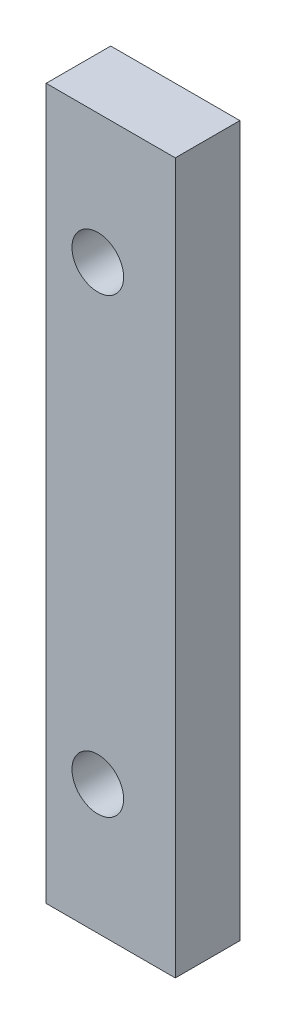
ISO-10303-21;
HEADER;
FILE_DESCRIPTION(('STEP AP214'),'2;1');
FILE_NAME('part.step','',(''),(''),'','','');
FILE_SCHEMA(('AUTOMOTIVE_DESIGN { 1 0 10303 214 1 1 1 1 }'));
ENDSEC;
DATA;
#1=APPLICATION_CONTEXT('core data for automotive mechanical design processes');
#2=APPLICATION_PROTOCOL_DEFINITION('international standard','automotive_design',2000,#1);
#3=PRODUCT_CONTEXT('',#1,'mechanical');
#4=PRODUCT('Part','Part','',(#3));
#5=PRODUCT_RELATED_PRODUCT_CATEGORY('part','',(#4));
#6=PRODUCT_DEFINITION_FORMATION('','',#4);
#7=PRODUCT_DEFINITION_CONTEXT('part definition',#1,'design');
#8=PRODUCT_DEFINITION('design','',#6,#7);
#9=PRODUCT_DEFINITION_SHAPE('','',#8);
#10=(LENGTH_UNIT() NAMED_UNIT(*) SI_UNIT(.MILLI.,.METRE.));
#11=(NAMED_UNIT(*) PLANE_ANGLE_UNIT() SI_UNIT($,.RADIAN.));
#12=(NAMED_UNIT(*) SI_UNIT($,.STERADIAN.) SOLID_ANGLE_UNIT());
#13=UNCERTAINTY_MEASURE_WITH_UNIT(LENGTH_MEASURE(1.E-05),#10,'distance_accuracy_value','');
#14=(GEOMETRIC_REPRESENTATION_CONTEXT(3) GLOBAL_UNCERTAINTY_ASSIGNED_CONTEXT((#13)) GLOBAL_UNIT_ASSIGNED_CONTEXT((#10,
#11,#12)) REPRESENTATION_CONTEXT('',''));
#15=CARTESIAN_POINT('',(0.,0.,0.));
#16=DIRECTION('',(0.,0.,1.));
#17=DIRECTION('',(1.,0.,0.));
#18=AXIS2_PLACEMENT_3D('',#15,#16,#17);
#19=CARTESIAN_POINT('',(0.,0.,5.));
#20=DIRECTION('',(0.,0.,1.));
#21=DIRECTION('',(1.,0.,0.));
#22=AXIS2_PLACEMENT_3D('',#19,#20,#21);
#23=PLANE('',#22);
#24=CARTESIAN_POINT('',(-6.,45.,5.));
#25=DIRECTION('',(0.,0.,1.));
#26=DIRECTION('',(1.,0.,0.));
#27=AXIS2_PLACEMENT_3D('',#24,#25,#26);
#28=CIRCLE('',#27,2.);
#29=CARTESIAN_POINT('',(-4.,45.,5.));
#30=VERTEX_POINT('',#29);
#31=EDGE_CURVE('E102',#30,#30,#28,.T.);
#32=ORIENTED_EDGE('',*,*,#31,.F.);
#33=EDGE_LOOP('',(#32));
#34=FACE_BOUND('',#33,.T.);
#35=DIRECTION('',(0.,1.,0.));
#36=VECTOR('',#35,1.);
#37=CARTESIAN_POINT('',(0.,0.,5.));
#38=LINE('',#37,#36);
#39=CARTESIAN_POINT('',(0.,0.,5.));
#40=VERTEX_POINT('',#39);
#41=CARTESIAN_POINT('',(0.,55.,5.));
#42=VERTEX_POINT('',#41);
#43=EDGE_CURVE('E87',#40,#42,#38,.T.);
#44=ORIENTED_EDGE('',*,*,#43,.T.);
#45=DIRECTION('',(-1.,0.,0.));
#46=VECTOR('',#45,1.);
#47=CARTESIAN_POINT('',(0.,55.,5.));
#48=LINE('',#47,#46);
#49=CARTESIAN_POINT('',(-10.,55.,5.));
#50=VERTEX_POINT('',#49);
#51=EDGE_CURVE('E82',#42,#50,#48,.T.);
#52=ORIENTED_EDGE('',*,*,#51,.T.);
#53=DIRECTION('',(0.,-1.,0.));
#54=VECTOR('',#53,1.);
#55=CARTESIAN_POINT('',(-10.,0.,5.));
#56=LINE('',#55,#54);
#57=CARTESIAN_POINT('',(-10.,0.,5.));
#58=VERTEX_POINT('',#57);
#59=EDGE_CURVE('E85',#50,#58,#56,.T.);
#60=ORIENTED_EDGE('',*,*,#59,.T.);
#61=DIRECTION('',(1.,0.,0.));
#62=VECTOR('',#61,1.);
#63=CARTESIAN_POINT('',(0.,0.,5.));
#64=LINE('',#63,#62);
#65=EDGE_CURVE('E52',#58,#40,#64,.T.);
#66=ORIENTED_EDGE('',*,*,#65,.T.);
#67=EDGE_LOOP('',(#44,#52,#60,#66));
#68=FACE_BOUND('',#67,.T.);
#69=CARTESIAN_POINT('',(-6.,10.,5.));
#70=DIRECTION('',(0.,0.,1.));
#71=DIRECTION('',(1.,0.,0.));
#72=AXIS2_PLACEMENT_3D('',#69,#70,#71);
#73=CIRCLE('',#72,2.);
#74=CARTESIAN_POINT('',(-4.,10.,5.));
#75=VERTEX_POINT('',#74);
#76=EDGE_CURVE('E117',#75,#75,#73,.T.);
#77=ORIENTED_EDGE('',*,*,#76,.F.);
#78=EDGE_LOOP('',(#77));
#79=FACE_BOUND('',#78,.T.);
#80=ADVANCED_FACE('F35',(#34,#68,#79),#23,.T.);
#81=CARTESIAN_POINT('',(0.,0.,0.));
#82=DIRECTION('',(0.,0.,1.));
#83=DIRECTION('',(1.,0.,0.));
#84=AXIS2_PLACEMENT_3D('',#81,#82,#83);
#85=PLANE('',#84);
#86=DIRECTION('',(0.,1.,0.));
#87=VECTOR('',#86,1.);
#88=CARTESIAN_POINT('',(0.,0.,0.));
#89=LINE('',#88,#87);
#90=CARTESIAN_POINT('',(0.,0.,0.));
#91=VERTEX_POINT('',#90);
#92=CARTESIAN_POINT('',(0.,55.,0.));
#93=VERTEX_POINT('',#92);
#94=EDGE_CURVE('E99',#91,#93,#89,.T.);
#95=ORIENTED_EDGE('',*,*,#94,.F.);
#96=DIRECTION('',(1.,0.,0.));
#97=VECTOR('',#96,1.);
#98=CARTESIAN_POINT('',(0.,0.,0.));
#99=LINE('',#98,#97);
#100=CARTESIAN_POINT('',(-10.,0.,0.));
#101=VERTEX_POINT('',#100);
#102=EDGE_CURVE('E75',#101,#91,#99,.T.);
#103=ORIENTED_EDGE('',*,*,#102,.F.);
#104=DIRECTION('',(0.,-1.,0.));
#105=VECTOR('',#104,1.);
#106=CARTESIAN_POINT('',(-10.,0.,0.));
#107=LINE('',#106,#105);
#108=CARTESIAN_POINT('',(-10.,55.,0.));
#109=VERTEX_POINT('',#108);
#110=EDGE_CURVE('E69',#109,#101,#107,.T.);
#111=ORIENTED_EDGE('',*,*,#110,.F.);
#112=DIRECTION('',(-1.,0.,0.));
#113=VECTOR('',#112,1.);
#114=CARTESIAN_POINT('',(0.,55.,0.));
#115=LINE('',#114,#113);
#116=EDGE_CURVE('E91',#93,#109,#115,.T.);
#117=ORIENTED_EDGE('',*,*,#116,.F.);
#118=EDGE_LOOP('',(#95,#103,#111,#117));
#119=FACE_BOUND('',#118,.T.);
#120=CARTESIAN_POINT('',(-6.,45.,0.));
#121=DIRECTION('',(0.,0.,1.));
#122=DIRECTION('',(1.,0.,0.));
#123=AXIS2_PLACEMENT_3D('',#120,#121,#122);
#124=CIRCLE('',#123,2.);
#125=CARTESIAN_POINT('',(-4.,45.,0.));
#126=VERTEX_POINT('',#125);
#127=EDGE_CURVE('E114',#126,#126,#124,.T.);
#128=ORIENTED_EDGE('',*,*,#127,.T.);
#129=EDGE_LOOP('',(#128));
#130=FACE_BOUND('',#129,.T.);
#131=CARTESIAN_POINT('',(-6.,10.,0.));
#132=DIRECTION('',(0.,0.,1.));
#133=DIRECTION('',(1.,0.,0.));
#134=AXIS2_PLACEMENT_3D('',#131,#132,#133);
#135=CIRCLE('',#134,2.);
#136=CARTESIAN_POINT('',(-4.,10.,0.));
#137=VERTEX_POINT('',#136);
#138=EDGE_CURVE('E120',#137,#137,#135,.T.);
#139=ORIENTED_EDGE('',*,*,#138,.T.);
#140=EDGE_LOOP('',(#139));
#141=FACE_BOUND('',#140,.T.);
#142=ADVANCED_FACE('F110',(#119,#130,#141),#85,.F.);
#143=CARTESIAN_POINT('',(0.,0.,5.));
#144=DIRECTION('',(-1.,0.,0.));
#145=DIRECTION('',(0.,0.,1.));
#146=AXIS2_PLACEMENT_3D('',#143,#144,#145);
#147=PLANE('',#146);
#148=ORIENTED_EDGE('',*,*,#94,.T.);
#149=DIRECTION('',(0.,0.,-1.));
#150=VECTOR('',#149,1.);
#151=CARTESIAN_POINT('',(0.,55.,5.));
#152=LINE('',#151,#150);
#153=EDGE_CURVE('E11',#42,#93,#152,.T.);
#154=ORIENTED_EDGE('',*,*,#153,.F.);
#155=ORIENTED_EDGE('',*,*,#43,.F.);
#156=DIRECTION('',(0.,0.,-1.));
#157=VECTOR('',#156,1.);
#158=CARTESIAN_POINT('',(0.,0.,5.));
#159=LINE('',#158,#157);
#160=EDGE_CURVE('E95',#40,#91,#159,.T.);
#161=ORIENTED_EDGE('',*,*,#160,.T.);
#162=EDGE_LOOP('',(#148,#154,#155,#161));
#163=FACE_BOUND('',#162,.T.);
#164=ADVANCED_FACE('F37',(#163),#147,.F.);
#165=CARTESIAN_POINT('',(0.,55.,5.));
#166=DIRECTION('',(0.,-1.,0.));
#167=DIRECTION('',(1.,0.,0.));
#168=AXIS2_PLACEMENT_3D('',#165,#166,#167);
#169=PLANE('',#168);
#170=ORIENTED_EDGE('',*,*,#116,.T.);
#171=DIRECTION('',(0.,0.,-1.));
#172=VECTOR('',#171,1.);
#173=CARTESIAN_POINT('',(-10.,55.,5.));
#174=LINE('',#173,#172);
#175=EDGE_CURVE('E44',#50,#109,#174,.T.);
#176=ORIENTED_EDGE('',*,*,#175,.F.);
#177=ORIENTED_EDGE('',*,*,#51,.F.);
#178=ORIENTED_EDGE('',*,*,#153,.T.);
#179=EDGE_LOOP('',(#170,#176,#177,#178));
#180=FACE_BOUND('',#179,.T.);
#181=ADVANCED_FACE('F90',(#180),#169,.F.);
#182=CARTESIAN_POINT('',(-10.,0.,5.));
#183=DIRECTION('',(1.,0.,0.));
#184=DIRECTION('',(0.,0.,-1.));
#185=AXIS2_PLACEMENT_3D('',#182,#183,#184);
#186=PLANE('',#185);
#187=ORIENTED_EDGE('',*,*,#110,.T.);
#188=DIRECTION('',(0.,0.,-1.));
#189=VECTOR('',#188,1.);
#190=CARTESIAN_POINT('',(-10.,0.,5.));
#191=LINE('',#190,#189);
#192=EDGE_CURVE('E92',#58,#101,#191,.T.);
#193=ORIENTED_EDGE('',*,*,#192,.F.);
#194=ORIENTED_EDGE('',*,*,#59,.F.);
#195=ORIENTED_EDGE('',*,*,#175,.T.);
#196=EDGE_LOOP('',(#187,#193,#194,#195));
#197=FACE_BOUND('',#196,.T.);
#198=ADVANCED_FACE('F93',(#197),#186,.F.);
#199=CARTESIAN_POINT('',(0.,0.,5.));
#200=DIRECTION('',(0.,1.,0.));
#201=DIRECTION('',(-1.,0.,0.));
#202=AXIS2_PLACEMENT_3D('',#199,#200,#201);
#203=PLANE('',#202);
#204=ORIENTED_EDGE('',*,*,#102,.T.);
#205=ORIENTED_EDGE('',*,*,#160,.F.);
#206=ORIENTED_EDGE('',*,*,#65,.F.);
#207=ORIENTED_EDGE('',*,*,#192,.T.);
#208=EDGE_LOOP('',(#204,#205,#206,#207));
#209=FACE_BOUND('',#208,.T.);
#210=ADVANCED_FACE('F107',(#209),#203,.F.);
#211=CARTESIAN_POINT('',(-6.,45.,5.));
#212=DIRECTION('',(0.,0.,-1.));
#213=DIRECTION('',(-1.,0.,0.));
#214=AXIS2_PLACEMENT_3D('',#211,#212,#213);
#215=CYLINDRICAL_SURFACE('',#214,2.);
#216=ORIENTED_EDGE('',*,*,#31,.T.);
#217=EDGE_LOOP('',(#216));
#218=FACE_BOUND('',#217,.T.);
#219=ORIENTED_EDGE('',*,*,#127,.F.);
#220=EDGE_LOOP('',(#219));
#221=FACE_BOUND('',#220,.T.);
#222=ADVANCED_FACE('F137',(#218,#221),#215,.F.);
#223=CARTESIAN_POINT('',(-6.,10.,5.));
#224=DIRECTION('',(0.,0.,-1.));
#225=DIRECTION('',(-1.,0.,0.));
#226=AXIS2_PLACEMENT_3D('',#223,#224,#225);
#227=CYLINDRICAL_SURFACE('',#226,2.);
#228=ORIENTED_EDGE('',*,*,#76,.T.);
#229=EDGE_LOOP('',(#228));
#230=FACE_BOUND('',#229,.T.);
#231=ORIENTED_EDGE('',*,*,#138,.F.);
#232=EDGE_LOOP('',(#231));
#233=FACE_BOUND('',#232,.T.);
#234=ADVANCED_FACE('F126',(#230,#233),#227,.F.);
#235=CLOSED_SHELL('',(#80,#142,#164,#181,#198,#210,#222,#234));
#236=MANIFOLD_SOLID_BREP('B2',#235);
#237=ADVANCED_BREP_SHAPE_REPRESENTATION('',(#18,#236),#14);
#238=SHAPE_DEFINITION_REPRESENTATION(#9,#237);
ENDSEC;
END-ISO-10303-21;
